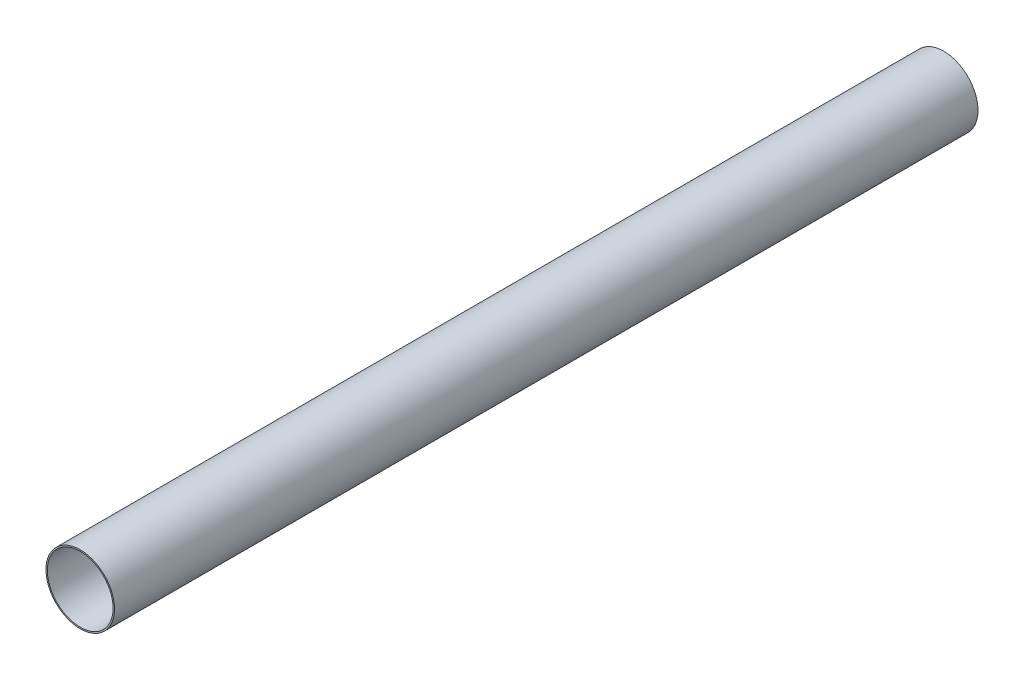
ISO-10303-21;
HEADER;
FILE_DESCRIPTION(('STEP AP214'),'2;1');
FILE_NAME('part.step','',(''),(''),'','','');
FILE_SCHEMA(('AUTOMOTIVE_DESIGN { 1 0 10303 214 1 1 1 1 }'));
ENDSEC;
DATA;
#1=APPLICATION_CONTEXT('core data for automotive mechanical design processes');
#2=APPLICATION_PROTOCOL_DEFINITION('international standard','automotive_design',2000,#1);
#3=PRODUCT_CONTEXT('',#1,'mechanical');
#4=PRODUCT('Part','Part','',(#3));
#5=PRODUCT_RELATED_PRODUCT_CATEGORY('part','',(#4));
#6=PRODUCT_DEFINITION_FORMATION('','',#4);
#7=PRODUCT_DEFINITION_CONTEXT('part definition',#1,'design');
#8=PRODUCT_DEFINITION('design','',#6,#7);
#9=PRODUCT_DEFINITION_SHAPE('','',#8);
#10=(LENGTH_UNIT() NAMED_UNIT(*) SI_UNIT(.MILLI.,.METRE.));
#11=(NAMED_UNIT(*) PLANE_ANGLE_UNIT() SI_UNIT($,.RADIAN.));
#12=(NAMED_UNIT(*) SI_UNIT($,.STERADIAN.) SOLID_ANGLE_UNIT());
#13=UNCERTAINTY_MEASURE_WITH_UNIT(LENGTH_MEASURE(1.E-05),#10,'distance_accuracy_value','');
#14=(GEOMETRIC_REPRESENTATION_CONTEXT(3) GLOBAL_UNCERTAINTY_ASSIGNED_CONTEXT((#13)) GLOBAL_UNIT_ASSIGNED_CONTEXT((#10,
#11,#12)) REPRESENTATION_CONTEXT('',''));
#15=CARTESIAN_POINT('',(0.,0.,0.));
#16=DIRECTION('',(0.,0.,1.));
#17=DIRECTION('',(1.,0.,0.));
#18=AXIS2_PLACEMENT_3D('',#15,#16,#17);
#19=CARTESIAN_POINT('',(0.,0.,0.));
#20=DIRECTION('',(0.,0.,1.));
#21=DIRECTION('',(1.,0.,0.));
#22=AXIS2_PLACEMENT_3D('',#19,#20,#21);
#23=PLANE('',#22);
#24=CARTESIAN_POINT('',(0.,0.,0.));
#25=DIRECTION('',(0.,0.,1.));
#26=DIRECTION('',(1.,0.,0.));
#27=AXIS2_PLACEMENT_3D('',#24,#25,#26);
#28=CIRCLE('',#27,75.);
#29=CARTESIAN_POINT('',(75.,0.,0.));
#30=VERTEX_POINT('',#29);
#31=EDGE_CURVE('E39',#30,#30,#28,.T.);
#32=ORIENTED_EDGE('',*,*,#31,.F.);
#33=EDGE_LOOP('',(#32));
#34=FACE_BOUND('',#33,.T.);
#35=CARTESIAN_POINT('',(0.,0.,0.));
#36=DIRECTION('',(0.,0.,1.));
#37=DIRECTION('',(1.,0.,0.));
#38=AXIS2_PLACEMENT_3D('',#35,#36,#37);
#39=CIRCLE('',#38,72.);
#40=CARTESIAN_POINT('',(72.,0.,0.));
#41=VERTEX_POINT('',#40);
#42=EDGE_CURVE('E48',#41,#41,#39,.T.);
#43=ORIENTED_EDGE('',*,*,#42,.T.);
#44=EDGE_LOOP('',(#43));
#45=FACE_BOUND('',#44,.T.);
#46=ADVANCED_FACE('F32',(#34,#45),#23,.F.);
#47=CARTESIAN_POINT('',(0.,0.,2123.35400774156));
#48=DIRECTION('',(0.,0.,-1.));
#49=DIRECTION('',(-1.,0.,0.));
#50=AXIS2_PLACEMENT_3D('',#47,#48,#49);
#51=CYLINDRICAL_SURFACE('',#50,75.);
#52=CARTESIAN_POINT('',(0.,0.,1891.22197338559));
#53=DIRECTION('',(0.,0.,-1.));
#54=DIRECTION('',(0.,1.,0.));
#55=AXIS2_PLACEMENT_3D('',#52,#53,#54);
#56=CIRCLE('',#55,75.);
#57=CARTESIAN_POINT('',(0.,75.,1891.22197338559));
#58=VERTEX_POINT('',#57);
#59=EDGE_CURVE('E43',#58,#58,#56,.T.);
#60=ORIENTED_EDGE('',*,*,#59,.T.);
#61=EDGE_LOOP('',(#60));
#62=FACE_BOUND('',#61,.T.);
#63=ORIENTED_EDGE('',*,*,#31,.T.);
#64=EDGE_LOOP('',(#63));
#65=FACE_BOUND('',#64,.T.);
#66=ADVANCED_FACE('F56',(#62,#65),#51,.T.);
#67=CARTESIAN_POINT('',(0.,0.,2123.35400774156));
#68=DIRECTION('',(0.,0.,-1.));
#69=DIRECTION('',(-1.,0.,0.));
#70=AXIS2_PLACEMENT_3D('',#67,#68,#69);
#71=CYLINDRICAL_SURFACE('',#70,72.);
#72=CARTESIAN_POINT('',(0.,0.,1891.22197338559));
#73=DIRECTION('',(0.,0.,-1.));
#74=DIRECTION('',(0.,1.,0.));
#75=AXIS2_PLACEMENT_3D('',#72,#73,#74);
#76=CIRCLE('',#75,72.);
#77=CARTESIAN_POINT('',(0.,72.,1891.22197338559));
#78=VERTEX_POINT('',#77);
#79=EDGE_CURVE('E10',#78,#78,#76,.T.);
#80=ORIENTED_EDGE('',*,*,#79,.F.);
#81=EDGE_LOOP('',(#80));
#82=FACE_BOUND('',#81,.T.);
#83=ORIENTED_EDGE('',*,*,#42,.F.);
#84=EDGE_LOOP('',(#83));
#85=FACE_BOUND('',#84,.T.);
#86=ADVANCED_FACE('F54',(#82,#85),#71,.F.);
#87=CARTESIAN_POINT('',(72.0000000000001,-155.862113582129,1891.22197338559));
#88=DIRECTION('',(0.,0.,-1.));
#89=DIRECTION('',(-1.,0.,0.));
#90=AXIS2_PLACEMENT_3D('',#87,#88,#89);
#91=PLANE('',#90);
#92=ORIENTED_EDGE('',*,*,#79,.T.);
#93=EDGE_LOOP('',(#92));
#94=FACE_BOUND('',#93,.T.);
#95=ORIENTED_EDGE('',*,*,#59,.F.);
#96=EDGE_LOOP('',(#95));
#97=FACE_BOUND('',#96,.T.);
#98=ADVANCED_FACE('F34',(#94,#97),#91,.F.);
#99=CLOSED_SHELL('',(#46,#66,#86,#98));
#100=MANIFOLD_SOLID_BREP('B2',#99);
#101=ADVANCED_BREP_SHAPE_REPRESENTATION('',(#18,#100),#14);
#102=SHAPE_DEFINITION_REPRESENTATION(#9,#101);
ENDSEC;
END-ISO-10303-21;
